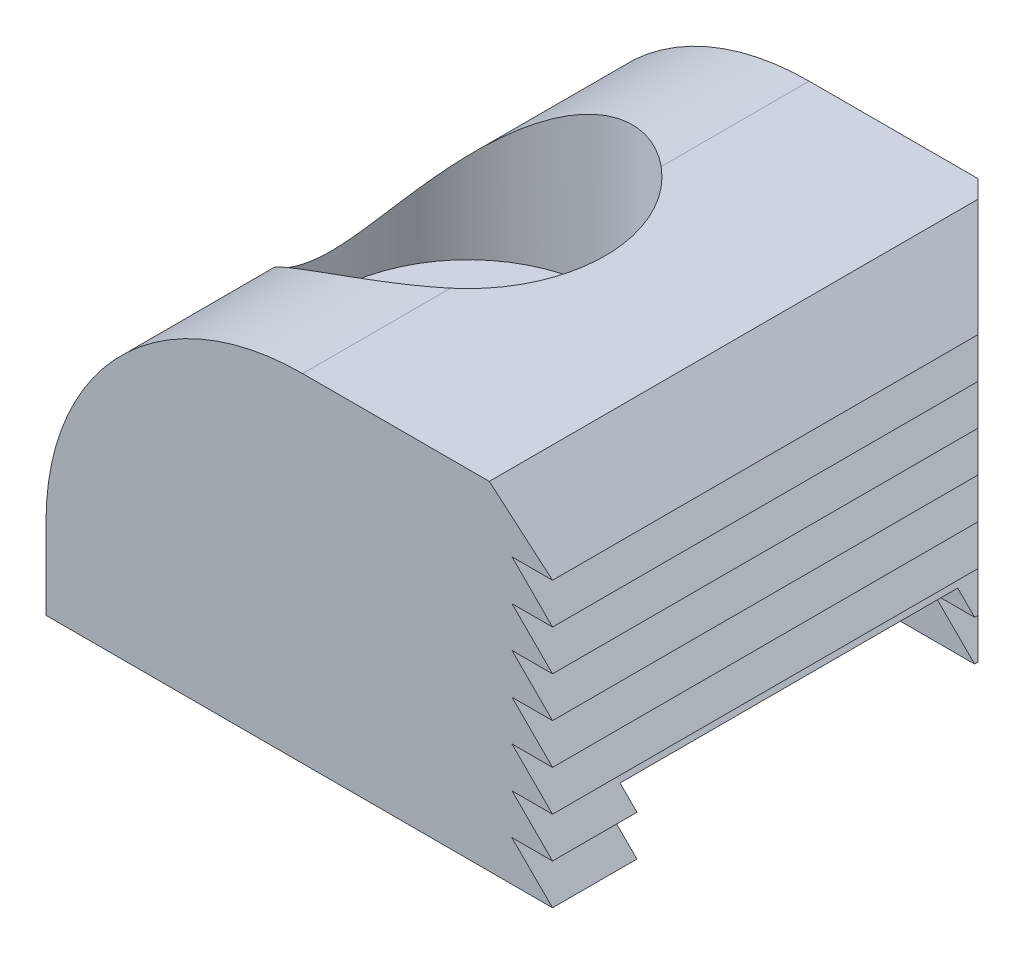
ISO-10303-21;
HEADER;
FILE_DESCRIPTION(('STEP AP214'),'2;1');
FILE_NAME('part.step','',(''),(''),'','','');
FILE_SCHEMA(('AUTOMOTIVE_DESIGN { 1 0 10303 214 1 1 1 1 }'));
ENDSEC;
DATA;
#1=APPLICATION_CONTEXT('core data for automotive mechanical design processes');
#2=APPLICATION_PROTOCOL_DEFINITION('international standard','automotive_design',2000,#1);
#3=PRODUCT_CONTEXT('',#1,'mechanical');
#4=PRODUCT('Part','Part','',(#3));
#5=PRODUCT_RELATED_PRODUCT_CATEGORY('part','',(#4));
#6=PRODUCT_DEFINITION_FORMATION('','',#4);
#7=PRODUCT_DEFINITION_CONTEXT('part definition',#1,'design');
#8=PRODUCT_DEFINITION('design','',#6,#7);
#9=PRODUCT_DEFINITION_SHAPE('','',#8);
#10=(LENGTH_UNIT() NAMED_UNIT(*) SI_UNIT(.MILLI.,.METRE.));
#11=(NAMED_UNIT(*) PLANE_ANGLE_UNIT() SI_UNIT($,.RADIAN.));
#12=(NAMED_UNIT(*) SI_UNIT($,.STERADIAN.) SOLID_ANGLE_UNIT());
#13=UNCERTAINTY_MEASURE_WITH_UNIT(LENGTH_MEASURE(1.E-05),#10,'distance_accuracy_value','');
#14=(GEOMETRIC_REPRESENTATION_CONTEXT(3) GLOBAL_UNCERTAINTY_ASSIGNED_CONTEXT((#13)) GLOBAL_UNIT_ASSIGNED_CONTEXT((#10,
#11,#12)) REPRESENTATION_CONTEXT('',''));
#15=CARTESIAN_POINT('',(0.,0.,0.));
#16=DIRECTION('',(0.,0.,1.));
#17=DIRECTION('',(1.,0.,0.));
#18=AXIS2_PLACEMENT_3D('',#15,#16,#17);
#19=CARTESIAN_POINT('',(9.652,-3.33693763246538,0.));
#20=DIRECTION('',(0.,0.,1.));
#21=DIRECTION('',(1.,0.,0.));
#22=AXIS2_PLACEMENT_3D('',#19,#20,#21);
#23=CYLINDRICAL_SURFACE('',#22,9.652);
#24=DIRECTION('',(0.,0.,-1.));
#25=VECTOR('',#24,1.);
#26=CARTESIAN_POINT('',(0.,-3.33693763246538,0.));
#27=LINE('',#26,#25);
#28=CARTESIAN_POINT('',(0.,-3.33693763246538,9.525));
#29=VERTEX_POINT('',#28);
#30=CARTESIAN_POINT('',(0.,-3.33693763246538,-9.525));
#31=VERTEX_POINT('',#30);
#32=EDGE_CURVE('E294',#29,#31,#27,.T.);
#33=ORIENTED_EDGE('',*,*,#32,.F.);
#34=CARTESIAN_POINT('',(9.652,-3.33693763246538,9.525));
#35=DIRECTION('',(0.,0.,-1.));
#36=DIRECTION('',(-1.,0.,0.));
#37=AXIS2_PLACEMENT_3D('',#34,#35,#36);
#38=CIRCLE('',#37,9.652);
#39=CARTESIAN_POINT('',(9.652,6.31506236753462,9.525));
#40=VERTEX_POINT('',#39);
#41=EDGE_CURVE('E318',#40,#29,#38,.F.);
#42=ORIENTED_EDGE('',*,*,#41,.F.);
#43=DIRECTION('',(0.,0.,-1.));
#44=VECTOR('',#43,1.);
#45=CARTESIAN_POINT('',(9.652,6.31506236753462,0.));
#46=LINE('',#45,#44);
#47=CARTESIAN_POINT('',(9.652,6.31506236753462,3.96020131306478));
#48=VERTEX_POINT('',#47);
#49=EDGE_CURVE('E259',#48,#40,#46,.F.);
#50=ORIENTED_EDGE('',*,*,#49,.F.);
#51=CARTESIAN_POINT('',(9.652,6.31506236753462,-3.96020131306478));
#52=CARTESIAN_POINT('',(9.5498199050069,6.31507265630244,-4.04542293708733));
#53=CARTESIAN_POINT('',(9.44430716040626,6.31344032708261,-4.12667015255437));
#54=CARTESIAN_POINT('',(9.22738867310542,6.30632604065309,-4.28073388266501));
#55=CARTESIAN_POINT('',(9.11598170572454,6.30084328048693,-4.3535486351398));
#56=CARTESIAN_POINT('',(8.88820903687942,6.28547127418843,-4.49015841113375));
#57=CARTESIAN_POINT('',(8.77184862060388,6.27558662320658,-4.55396274941192));
#58=CARTESIAN_POINT('',(8.5349841575829,6.25094797968316,-4.67223286497519));
#59=CARTESIAN_POINT('',(8.41448055410677,6.23619450660157,-4.72669963755387));
#60=CARTESIAN_POINT('',(8.17007884348161,6.20142045959126,-4.82609011750387));
#61=CARTESIAN_POINT('',(8.04617501644172,6.18139045230201,-4.87099647017519));
#62=CARTESIAN_POINT('',(7.79617530813473,6.1358216009373,-4.95098032679101));
#63=CARTESIAN_POINT('',(7.67007863676134,6.11028073177351,-4.98605420665242));
#64=CARTESIAN_POINT('',(7.41692635389342,6.05360844368939,-5.04628355442121));
#65=CARTESIAN_POINT('',(7.28987188007876,6.02248288502663,-5.07144933174537));
#66=CARTESIAN_POINT('',(7.03565690436223,5.9546268203021,-5.11202993300492));
#67=CARTESIAN_POINT('',(6.90849638054905,5.91789420731241,-5.12744108025322));
#68=CARTESIAN_POINT('',(6.65662734927728,5.83944638506792,-5.14860666135073));
#69=CARTESIAN_POINT('',(6.53190786099641,5.7977974957276,-5.1544767158451));
#70=CARTESIAN_POINT('',(6.28417205276451,5.70939731183465,-5.15726994649628));
#71=CARTESIAN_POINT('',(6.16115635427996,5.66264420799496,-5.15418994015681));
#72=CARTESIAN_POINT('',(5.79576872527315,5.51514553557289,-5.13212250251429));
#73=CARTESIAN_POINT('',(5.55697877425631,5.40713643875073,-5.10031361975937));
#74=CARTESIAN_POINT('',(5.07172973626527,5.16382462154896,-5.00195750607391));
#75=CARTESIAN_POINT('',(4.82672662066485,5.02689858862933,-4.9323749140016));
#76=CARTESIAN_POINT('',(4.35727908457225,4.73790405925048,-4.7621275451857));
#77=CARTESIAN_POINT('',(4.13284737474377,4.58582632034211,-4.66144371725706));
#78=CARTESIAN_POINT('',(3.76350550215528,4.31319100976371,-4.46405611674769));
#79=CARTESIAN_POINT('',(3.61339343195176,4.19509694488831,-4.37350528343616));
#80=CARTESIAN_POINT('',(3.32531788668719,3.95479424232148,-4.1794559870006));
#81=CARTESIAN_POINT('',(3.18735453639237,3.83258556239114,-4.07595739093068));
#82=CARTESIAN_POINT('',(2.92338799778348,3.58546500516873,-3.85671429155394));
#83=CARTESIAN_POINT('',(2.79741352424899,3.4605474761992,-3.74094172513649));
#84=CARTESIAN_POINT('',(2.55785441513575,3.21013757121912,-3.49787756546927));
#85=CARTESIAN_POINT('',(2.44426590354373,3.08464538792209,-3.37058959874874));
#86=CARTESIAN_POINT('',(2.25223274965274,2.86156329616766,-3.13255308790216));
#87=CARTESIAN_POINT('',(2.17142934318816,2.76367210113431,-3.02398031231244));
#88=CARTESIAN_POINT('',(2.01773064827471,2.57020127866494,-2.79935173323291));
#89=CARTESIAN_POINT('',(1.94483686435673,2.47462209368592,-2.68329451275768));
#90=CARTESIAN_POINT('',(1.80748105025036,2.2878307440007,-2.44355434168091));
#91=CARTESIAN_POINT('',(1.7429959109904,2.19660706676655,-2.31989372692717));
#92=CARTESIAN_POINT('',(1.62281870203423,2.02073718898965,-2.06400601648764));
#93=CARTESIAN_POINT('',(1.5671200725287,1.93608610570469,-1.93178541650986));
#94=CARTESIAN_POINT('',(1.46225271797532,1.77179939115867,-1.64936610974198));
#95=CARTESIAN_POINT('',(1.41369866036225,1.69279516354846,-1.49856153611027));
#96=CARTESIAN_POINT('',(1.3293771578117,1.55200923336524,-1.18569904927869));
#97=CARTESIAN_POINT('',(1.29358996285923,1.49020096197845,-1.02365898504788));
#98=CARTESIAN_POINT('',(1.24187026017632,1.39942514015905,-0.71659895222839));
#99=CARTESIAN_POINT('',(1.22365602826336,1.36675256515076,-0.573093576234786));
#100=CARTESIAN_POINT('',(1.19944477752231,1.32311385105439,-0.281854914211788));
#101=CARTESIAN_POINT('',(1.19343041719313,1.3121169017899,-0.134127932529159));
#102=CARTESIAN_POINT('',(1.19420575666567,1.31352668596921,0.161443628002224));
#103=CARTESIAN_POINT('',(1.20101851398767,1.32597556471977,0.309287940189907));
#104=CARTESIAN_POINT('',(1.22679186371245,1.37237621189909,0.600500142520499));
#105=CARTESIAN_POINT('',(1.24576983739812,1.4063587461475,0.743861319434351));
#106=CARTESIAN_POINT('',(1.30449740262346,1.50919876904701,1.08152183504694));
#107=CARTESIAN_POINT('',(1.34960418115294,1.5866839484327,1.27219581367968));
#108=CARTESIAN_POINT('',(1.45712526424442,1.76363552234426,1.63792326103005));
#109=CARTESIAN_POINT('',(1.51959797352423,1.86317585894052,1.8129213356505));
#110=CARTESIAN_POINT('',(1.65053071733687,2.06213943840468,2.12759506820695));
#111=CARTESIAN_POINT('',(1.71729456276134,2.16005446592775,2.26896248441957));
#112=CARTESIAN_POINT('',(1.86115271639638,2.36211455423867,2.54174117960632));
#113=CARTESIAN_POINT('',(1.93825453333294,2.46626411259604,2.67314511222003));
#114=CARTESIAN_POINT('',(2.10232463334536,2.67816847672798,2.92685708416846));
#115=CARTESIAN_POINT('',(2.18930542744099,2.78592772943494,3.04915325740314));
#116=CARTESIAN_POINT('',(2.37277395101704,3.00294920524562,3.28486929722818));
#117=CARTESIAN_POINT('',(2.46925930042156,3.11221104621316,3.39829137331868));
#118=CARTESIAN_POINT('',(2.67861575589638,3.3382669238152,3.62389540719421));
#119=CARTESIAN_POINT('',(2.79215751074991,3.45506195171626,3.73545507971485));
#120=CARTESIAN_POINT('',(3.02997029722527,3.68712366200068,3.94832445060814));
#121=CARTESIAN_POINT('',(3.15424288210933,3.80239012033231,4.04963266048098));
#122=CARTESIAN_POINT('',(3.41323535929083,4.02978264899015,4.24119183046905));
#123=CARTESIAN_POINT('',(3.54793700638176,4.14191375660394,4.33146141891937));
#124=CARTESIAN_POINT('',(3.82787163626985,4.36191393185475,4.50021906391816));
#125=CARTESIAN_POINT('',(3.97310548008676,4.46978264992015,4.57870615561945));
#126=CARTESIAN_POINT('',(4.24618296825254,4.66060458272654,4.70944505745998));
#127=CARTESIAN_POINT('',(4.37233146267602,4.74449928392301,4.76386849718004));
#128=CARTESIAN_POINT('',(4.63111098519171,4.90776798756518,4.86323158678523));
#129=CARTESIAN_POINT('',(4.76374065596987,4.98714292908173,4.90817321199577));
#130=CARTESIAN_POINT('',(5.03508020270358,5.14064795871205,4.98772257145255));
#131=CARTESIAN_POINT('',(5.17379199592603,5.21477637343177,5.02232701986135));
#132=CARTESIAN_POINT('',(5.45652012001272,5.35697257474782,5.08024620834094));
#133=CARTESIAN_POINT('',(5.60053406074814,5.42504304600904,5.10356596992063));
#134=CARTESIAN_POINT('',(5.8944187764567,5.55506709368841,5.1381847119216));
#135=CARTESIAN_POINT('',(6.04433267234228,5.61695527081453,5.14936546589495));
#136=CARTESIAN_POINT('',(6.34747013374335,5.73320746777246,5.15842810255943));
#137=CARTESIAN_POINT('',(6.50069375053475,5.78757137093756,5.15630977906695));
#138=CARTESIAN_POINT('',(6.8087414396419,5.88820210169364,5.13806647973519));
#139=CARTESIAN_POINT('',(6.96356306542272,5.93447978757886,5.12196046312798));
#140=CARTESIAN_POINT('',(7.27327809432175,6.01873052984422,5.07527999764991));
#141=CARTESIAN_POINT('',(7.42817147952068,6.05670507846205,5.04470815170425));
#142=CARTESIAN_POINT('',(7.71350752768924,6.11935415357739,4.97449028265757));
#143=CARTESIAN_POINT('',(7.8441966264966,6.14516326508192,4.93683941504562));
#144=CARTESIAN_POINT('',(8.10316164332057,6.19088972588237,4.85092120864088));
#145=CARTESIAN_POINT('',(8.23143654259081,6.21080463792107,4.80264949246027));
#146=CARTESIAN_POINT('',(8.48447127432828,6.24504029574331,4.69567026359144));
#147=CARTESIAN_POINT('',(8.60922761412099,6.25935565278526,4.63695277704712));
#148=CARTESIAN_POINT('',(8.8539502921863,6.28279858949162,4.50950719374196));
#149=CARTESIAN_POINT('',(8.9739187777131,6.29192851958392,4.44078365025932));
#150=CARTESIAN_POINT('',(9.20221149347913,6.3052200685889,4.29750218512099));
#151=CARTESIAN_POINT('',(9.31081782965703,6.30960912454235,4.2234135965756));
#152=CARTESIAN_POINT('',(9.52211073651756,6.31476702629258,4.06710996725251));
#153=CARTESIAN_POINT('',(9.62479706803935,6.31553572593254,3.9848945985267));
#154=CARTESIAN_POINT('',(9.82343425669457,6.31405018434085,3.81298766512504));
#155=CARTESIAN_POINT('',(9.91939396416691,6.31179999676562,3.72330627712291));
#156=CARTESIAN_POINT('',(10.1041419652241,6.30491011200844,3.53695647557787));
#157=CARTESIAN_POINT('',(10.1929316848539,6.30027089134411,3.44028945869591));
#158=CARTESIAN_POINT('',(10.2778622343753,6.29474967888265,3.34040367437355));
#159=B_SPLINE_CURVE_WITH_KNOTS('',3,(#51,#52,#53,#54,#55,#56,#57,#58,#59,#60,#61,#62,#63,#64,
#65,#66,#67,#68,#69,#70,#71,#72,#73,#74,#75,#76,#77,#78,#79,#80,#81,#82,#83,#84,#85,#86,#87,#88,
#89,#90,#91,#92,#93,#94,#95,#96,#97,#98,#99,#100,#101,#102,#103,#104,#105,#106,#107,#108,#109,
#110,#111,#112,#113,#114,#115,#116,#117,#118,#119,#120,#121,#122,#123,#124,#125,#126,#127,#128,
#129,#130,#131,#132,#133,#134,#135,#136,#137,#138,#139,#140,#141,#142,#143,#144,#145,#146,#147,
#148,#149,#150,#151,#152,#153,#154,#155,#156,#157,#158),.UNSPECIFIED.,.F.,.F.,(4,2,2,2,2,2,2,2,
2,2,2,2,2,2,2,2,2,2,2,2,2,2,2,2,2,2,2,2,2,2,2,2,2,2,2,2,2,2,2,2,2,2,2,2,2,2,2,2,2,2,2,2,2,4),
(0.,0.399074540379414,0.79823232719977,1.19697440490957,1.59567395413466,1.99509119162551,
2.39465545456784,2.79380286369613,3.19310062886868,3.58752254961611,3.9820847375532,
4.77096761699665,5.63540779147786,6.50037853578314,7.13374350459783,7.76711497725322,
8.40196716084153,9.03662010270682,9.53738519179449,10.0382453676792,10.537698662147,
11.0367772931288,11.5666391616303,12.0956777559208,12.5387255014225,12.9811430343731,
13.4243565989635,13.8682048290597,14.4967336869415,15.1274025214601,15.6800688290932,
16.2331387487542,16.7869170707711,17.3405570696408,17.932290409779,18.5241095459582,
19.1149157501229,19.7057703079711,20.1882705246237,20.6706701236029,21.1532228982645,
21.6355607465916,22.1225552559009,22.6095573153986,23.0959003097992,23.5821558267868,
23.9969149735175,24.4118453847164,24.8271741282542,25.242314462822,25.6365085812616,
26.0307186135114,26.4243998437207,26.8180025804912),.UNSPECIFIED.);
#160=CARTESIAN_POINT('',(9.652,6.31506236753462,-3.96020131306478));
#161=VERTEX_POINT('',#160);
#162=EDGE_CURVE('E310',#161,#48,#159,.T.);
#163=ORIENTED_EDGE('',*,*,#162,.F.);
#164=DIRECTION('',(0.,0.,-1.));
#165=VECTOR('',#164,1.);
#166=CARTESIAN_POINT('',(9.652,6.31506236753462,0.));
#167=LINE('',#166,#165);
#168=CARTESIAN_POINT('',(9.652,6.31506236753462,-9.525));
#169=VERTEX_POINT('',#168);
#170=EDGE_CURVE('E306',#169,#161,#167,.F.);
#171=ORIENTED_EDGE('',*,*,#170,.F.);
#172=CARTESIAN_POINT('',(9.652,-3.33693763246538,-9.525));
#173=DIRECTION('',(0.,0.,-1.));
#174=DIRECTION('',(-1.,0.,0.));
#175=AXIS2_PLACEMENT_3D('',#172,#173,#174);
#176=CIRCLE('',#175,9.652);
#177=EDGE_CURVE('E374',#31,#169,#176,.T.);
#178=ORIENTED_EDGE('',*,*,#177,.F.);
#179=EDGE_LOOP('',(#33,#42,#50,#163,#171,#178));
#180=FACE_BOUND('',#179,.T.);
#181=ADVANCED_FACE('F52',(#180),#23,.T.);
#182=CARTESIAN_POINT('',(19.05,-6.38493763246538,9.525));
#183=DIRECTION('',(0.,1.,0.));
#184=DIRECTION('',(0.,0.,1.));
#185=AXIS2_PLACEMENT_3D('',#182,#183,#184);
#186=PLANE('',#185);
#187=DIRECTION('',(-1.,0.,0.));
#188=VECTOR('',#187,1.);
#189=CARTESIAN_POINT('',(19.05,-6.38493763246538,-9.525));
#190=LINE('',#189,#188);
#191=CARTESIAN_POINT('',(16.002,-6.38493763246538,-9.525));
#192=VERTEX_POINT('',#191);
#193=CARTESIAN_POINT('',(0.,-6.38493763246538,-9.525));
#194=VERTEX_POINT('',#193);
#195=EDGE_CURVE('E268',#192,#194,#190,.T.);
#196=ORIENTED_EDGE('',*,*,#195,.F.);
#197=DIRECTION('',(-0.707106781186546,0.,-0.707106781186549));
#198=VECTOR('',#197,1.);
#199=CARTESIAN_POINT('',(16.002,-6.38493763246538,-9.525));
#200=LINE('',#199,#198);
#201=CARTESIAN_POINT('',(19.05,-6.38493763246538,-6.47699999999999));
#202=VERTEX_POINT('',#201);
#203=EDGE_CURVE('E287',#192,#202,#200,.F.);
#204=ORIENTED_EDGE('',*,*,#203,.T.);
#205=DIRECTION('',(0.,0.,-1.));
#206=VECTOR('',#205,1.);
#207=CARTESIAN_POINT('',(19.05,-6.38493763246538,9.525));
#208=LINE('',#207,#206);
#209=CARTESIAN_POINT('',(19.05,-6.38493763246538,-6.35));
#210=VERTEX_POINT('',#209);
#211=EDGE_CURVE('E270',#210,#202,#208,.T.);
#212=ORIENTED_EDGE('',*,*,#211,.F.);
#213=DIRECTION('',(-1.,0.,0.));
#214=VECTOR('',#213,1.);
#215=CARTESIAN_POINT('',(19.05,-6.38493763246538,-6.35));
#216=LINE('',#215,#214);
#217=CARTESIAN_POINT('',(0.,-6.38493763246538,-6.35));
#218=VERTEX_POINT('',#217);
#219=EDGE_CURVE('E443',#210,#218,#216,.T.);
#220=ORIENTED_EDGE('',*,*,#219,.T.);
#221=DIRECTION('',(0.,0.,-1.));
#222=VECTOR('',#221,1.);
#223=CARTESIAN_POINT('',(0.,-6.38493763246538,9.525));
#224=LINE('',#223,#222);
#225=EDGE_CURVE('E383',#218,#194,#224,.T.);
#226=ORIENTED_EDGE('',*,*,#225,.T.);
#227=EDGE_LOOP('',(#196,#204,#212,#220,#226));
#228=FACE_BOUND('',#227,.T.);
#229=ADVANCED_FACE('F355',(#228),#186,.F.);
#230=CARTESIAN_POINT('',(19.05,6.31506236753462,9.525));
#231=DIRECTION('',(0.,0.,-1.));
#232=DIRECTION('',(-1.,0.,0.));
#233=AXIS2_PLACEMENT_3D('',#230,#231,#232);
#234=PLANE('',#233);
#235=DIRECTION('',(-1.,0.,0.));
#236=VECTOR('',#235,1.);
#237=CARTESIAN_POINT('',(19.05,4.28306236753462,9.525));
#238=LINE('',#237,#236);
#239=CARTESIAN_POINT('',(19.05,4.28306236753462,9.525));
#240=VERTEX_POINT('',#239);
#241=CARTESIAN_POINT('',(17.526,4.28306236753462,9.525));
#242=VERTEX_POINT('',#241);
#243=EDGE_CURVE('E252',#240,#242,#238,.T.);
#244=ORIENTED_EDGE('',*,*,#243,.F.);
#245=DIRECTION('',(0.760172709036133,-0.64972105740592,0.));
#246=VECTOR('',#245,1.);
#247=CARTESIAN_POINT('',(19.05,4.28306236753462,9.525));
#248=LINE('',#247,#246);
#249=CARTESIAN_POINT('',(16.6725629027191,6.31506236753462,9.525));
#250=VERTEX_POINT('',#249);
#251=EDGE_CURVE('E236',#250,#240,#248,.T.);
#252=ORIENTED_EDGE('',*,*,#251,.F.);
#253=DIRECTION('',(-1.,0.,0.));
#254=VECTOR('',#253,1.);
#255=CARTESIAN_POINT('',(19.05,6.31506236753462,9.525));
#256=LINE('',#255,#254);
#257=EDGE_CURVE('E248',#250,#40,#256,.T.);
#258=ORIENTED_EDGE('',*,*,#257,.T.);
#259=ORIENTED_EDGE('',*,*,#41,.T.);
#260=DIRECTION('',(0.,-1.,0.));
#261=VECTOR('',#260,1.);
#262=CARTESIAN_POINT('',(0.,6.31506236753462,9.525));
#263=LINE('',#262,#261);
#264=CARTESIAN_POINT('',(0.,-6.38493763246538,9.525));
#265=VERTEX_POINT('',#264);
#266=EDGE_CURVE('E377',#29,#265,#263,.T.);
#267=ORIENTED_EDGE('',*,*,#266,.T.);
#268=DIRECTION('',(-1.,0.,0.));
#269=VECTOR('',#268,1.);
#270=CARTESIAN_POINT('',(19.05,-6.38493763246538,9.525));
#271=LINE('',#270,#269);
#272=CARTESIAN_POINT('',(19.05,-6.38493763246538,9.525));
#273=VERTEX_POINT('',#272);
#274=EDGE_CURVE('E279',#273,#265,#271,.T.);
#275=ORIENTED_EDGE('',*,*,#274,.F.);
#276=DIRECTION('',(0.709126234483074,-0.705081543913791,0.));
#277=VECTOR('',#276,1.);
#278=CARTESIAN_POINT('',(17.517257594982,-4.86093763246538,9.525));
#279=LINE('',#278,#277);
#280=CARTESIAN_POINT('',(17.517257594982,-4.86093763246538,9.525));
#281=VERTEX_POINT('',#280);
#282=EDGE_CURVE('E469',#281,#273,#279,.T.);
#283=ORIENTED_EDGE('',*,*,#282,.F.);
#284=DIRECTION('',(-1.,0.,0.));
#285=VECTOR('',#284,1.);
#286=CARTESIAN_POINT('',(19.05,-4.86093763246538,9.525));
#287=LINE('',#286,#285);
#288=CARTESIAN_POINT('',(19.05,-4.86093763246538,9.525));
#289=VERTEX_POINT('',#288);
#290=EDGE_CURVE('E471',#289,#281,#287,.T.);
#291=ORIENTED_EDGE('',*,*,#290,.F.);
#292=DIRECTION('',(0.707106781186548,-0.707106781186548,0.));
#293=VECTOR('',#292,1.);
#294=CARTESIAN_POINT('',(17.526,-3.33693763246538,9.525));
#295=LINE('',#294,#293);
#296=CARTESIAN_POINT('',(17.526,-3.33693763246538,9.525));
#297=VERTEX_POINT('',#296);
#298=EDGE_CURVE('E539',#297,#289,#295,.T.);
#299=ORIENTED_EDGE('',*,*,#298,.F.);
#300=DIRECTION('',(-1.,0.,0.));
#301=VECTOR('',#300,1.);
#302=CARTESIAN_POINT('',(19.05,-3.33693763246538,9.525));
#303=LINE('',#302,#301);
#304=CARTESIAN_POINT('',(19.05,-3.33693763246538,9.525));
#305=VERTEX_POINT('',#304);
#306=EDGE_CURVE('E534',#305,#297,#303,.T.);
#307=ORIENTED_EDGE('',*,*,#306,.F.);
#308=DIRECTION('',(0.707106781186548,-0.707106781186547,0.));
#309=VECTOR('',#308,1.);
#310=CARTESIAN_POINT('',(17.526,-1.81293763246538,9.525));
#311=LINE('',#310,#309);
#312=CARTESIAN_POINT('',(17.526,-1.81293763246538,9.525));
#313=VERTEX_POINT('',#312);
#314=EDGE_CURVE('E556',#313,#305,#311,.T.);
#315=ORIENTED_EDGE('',*,*,#314,.F.);
#316=DIRECTION('',(-1.,0.,0.));
#317=VECTOR('',#316,1.);
#318=CARTESIAN_POINT('',(19.05,-1.81293763246538,9.525));
#319=LINE('',#318,#317);
#320=CARTESIAN_POINT('',(19.05,-1.81293763246538,9.525));
#321=VERTEX_POINT('',#320);
#322=EDGE_CURVE('E550',#321,#313,#319,.T.);
#323=ORIENTED_EDGE('',*,*,#322,.F.);
#324=DIRECTION('',(0.707106781186548,-0.707106781186547,0.));
#325=VECTOR('',#324,1.);
#326=CARTESIAN_POINT('',(17.526,-0.28893763246538,9.525));
#327=LINE('',#326,#325);
#328=CARTESIAN_POINT('',(17.526,-0.28893763246538,9.525));
#329=VERTEX_POINT('',#328);
#330=EDGE_CURVE('E573',#329,#321,#327,.T.);
#331=ORIENTED_EDGE('',*,*,#330,.F.);
#332=DIRECTION('',(-1.,0.,0.));
#333=VECTOR('',#332,1.);
#334=CARTESIAN_POINT('',(19.05,-0.28893763246538,9.525));
#335=LINE('',#334,#333);
#336=CARTESIAN_POINT('',(19.05,-0.28893763246538,9.525));
#337=VERTEX_POINT('',#336);
#338=EDGE_CURVE('E567',#337,#329,#335,.T.);
#339=ORIENTED_EDGE('',*,*,#338,.F.);
#340=DIRECTION('',(0.707106781186548,-0.707106781186547,0.));
#341=VECTOR('',#340,1.);
#342=CARTESIAN_POINT('',(17.526,1.23506236753462,9.525));
#343=LINE('',#342,#341);
#344=CARTESIAN_POINT('',(17.526,1.23506236753462,9.525));
#345=VERTEX_POINT('',#344);
#346=EDGE_CURVE('E590',#345,#337,#343,.T.);
#347=ORIENTED_EDGE('',*,*,#346,.F.);
#348=DIRECTION('',(-1.,0.,0.));
#349=VECTOR('',#348,1.);
#350=CARTESIAN_POINT('',(19.05,1.23506236753462,9.525));
#351=LINE('',#350,#349);
#352=CARTESIAN_POINT('',(19.05,1.23506236753462,9.525));
#353=VERTEX_POINT('',#352);
#354=EDGE_CURVE('E584',#353,#345,#351,.T.);
#355=ORIENTED_EDGE('',*,*,#354,.F.);
#356=DIRECTION('',(0.707106781186548,-0.707106781186547,0.));
#357=VECTOR('',#356,1.);
#358=CARTESIAN_POINT('',(17.526,2.75906236753462,9.525));
#359=LINE('',#358,#357);
#360=CARTESIAN_POINT('',(17.526,2.75906236753462,9.525));
#361=VERTEX_POINT('',#360);
#362=EDGE_CURVE('E607',#361,#353,#359,.T.);
#363=ORIENTED_EDGE('',*,*,#362,.F.);
#364=DIRECTION('',(-1.,0.,0.));
#365=VECTOR('',#364,1.);
#366=CARTESIAN_POINT('',(19.05,2.75906236753462,9.525));
#367=LINE('',#366,#365);
#368=CARTESIAN_POINT('',(19.05,2.75906236753462,9.525));
#369=VERTEX_POINT('',#368);
#370=EDGE_CURVE('E601',#369,#361,#367,.T.);
#371=ORIENTED_EDGE('',*,*,#370,.F.);
#372=DIRECTION('',(0.707106781186548,-0.707106781186548,0.));
#373=VECTOR('',#372,1.);
#374=CARTESIAN_POINT('',(17.526,4.28306236753462,9.525));
#375=LINE('',#374,#373);
#376=EDGE_CURVE('E621',#242,#369,#375,.T.);
#377=ORIENTED_EDGE('',*,*,#376,.F.);
#378=EDGE_LOOP('',(#244,#252,#258,#259,#267,#275,#283,#291,#299,#307,#315,#323,#331,#339,#347,
#355,#363,#371,#377));
#379=FACE_BOUND('',#378,.T.);
#380=ADVANCED_FACE('F247',(#379),#234,.F.);
#381=CARTESIAN_POINT('',(0.,-6.38493763246538,6.35));
#382=VERTEX_POINT('',#381);
#383=EDGE_CURVE('E380',#265,#382,#224,.T.);
#384=ORIENTED_EDGE('',*,*,#383,.T.);
#385=DIRECTION('',(-1.,0.,0.));
#386=VECTOR('',#385,1.);
#387=CARTESIAN_POINT('',(19.05,-6.38493763246538,6.35));
#388=LINE('',#387,#386);
#389=CARTESIAN_POINT('',(19.05,-6.38493763246538,6.35));
#390=VERTEX_POINT('',#389);
#391=EDGE_CURVE('E447',#390,#382,#388,.T.);
#392=ORIENTED_EDGE('',*,*,#391,.F.);
#393=EDGE_CURVE('E262',#273,#390,#208,.T.);
#394=ORIENTED_EDGE('',*,*,#393,.F.);
#395=ORIENTED_EDGE('',*,*,#274,.T.);
#396=EDGE_LOOP('',(#384,#392,#394,#395));
#397=FACE_BOUND('',#396,.T.);
#398=ADVANCED_FACE('F350',(#397),#186,.F.);
#399=CARTESIAN_POINT('',(19.05,6.31506236753462,-9.525));
#400=DIRECTION('',(0.,0.,-1.));
#401=DIRECTION('',(-1.,0.,0.));
#402=AXIS2_PLACEMENT_3D('',#399,#400,#401);
#403=PLANE('',#402);
#404=DIRECTION('',(0.,-1.,0.));
#405=VECTOR('',#404,1.);
#406=CARTESIAN_POINT('',(0.,6.31506236753462,-9.525));
#407=LINE('',#406,#405);
#408=EDGE_CURVE('E273',#31,#194,#407,.T.);
#409=ORIENTED_EDGE('',*,*,#408,.F.);
#410=ORIENTED_EDGE('',*,*,#177,.T.);
#411=DIRECTION('',(-1.,0.,0.));
#412=VECTOR('',#411,1.);
#413=CARTESIAN_POINT('',(19.05,6.31506236753462,-9.525));
#414=LINE('',#413,#412);
#415=CARTESIAN_POINT('',(16.002,6.31506236753462,-9.525));
#416=VERTEX_POINT('',#415);
#417=EDGE_CURVE('E261',#416,#169,#414,.T.);
#418=ORIENTED_EDGE('',*,*,#417,.F.);
#419=DIRECTION('',(0.,-1.,0.));
#420=VECTOR('',#419,1.);
#421=CARTESIAN_POINT('',(16.002,6.31506236753462,-9.525));
#422=LINE('',#421,#420);
#423=EDGE_CURVE('E283',#416,#192,#422,.T.);
#424=ORIENTED_EDGE('',*,*,#423,.T.);
#425=ORIENTED_EDGE('',*,*,#195,.T.);
#426=EDGE_LOOP('',(#409,#410,#418,#424,#425));
#427=FACE_BOUND('',#426,.T.);
#428=ADVANCED_FACE('F347',(#427),#403,.T.);
#429=CARTESIAN_POINT('',(19.05,6.31506236753462,9.525));
#430=DIRECTION('',(0.,1.,0.));
#431=DIRECTION('',(0.,0.,1.));
#432=AXIS2_PLACEMENT_3D('',#429,#430,#431);
#433=PLANE('',#432);
#434=DIRECTION('',(0.,0.,1.));
#435=VECTOR('',#434,1.);
#436=CARTESIAN_POINT('',(16.6725629027191,6.31506236753462,-9.525));
#437=LINE('',#436,#435);
#438=CARTESIAN_POINT('',(16.6725629027191,6.31506236753462,-8.85443709728092));
#439=VERTEX_POINT('',#438);
#440=EDGE_CURVE('E233',#439,#250,#437,.T.);
#441=ORIENTED_EDGE('',*,*,#440,.F.);
#442=DIRECTION('',(0.707106781186546,0.,0.707106781186549));
#443=VECTOR('',#442,1.);
#444=CARTESIAN_POINT('',(27.051,6.31506236753462,1.52400000000003));
#445=LINE('',#444,#443);
#446=EDGE_CURVE('E291',#439,#416,#445,.F.);
#447=ORIENTED_EDGE('',*,*,#446,.T.);
#448=ORIENTED_EDGE('',*,*,#417,.T.);
#449=ORIENTED_EDGE('',*,*,#170,.T.);
#450=CARTESIAN_POINT('',(6.35,6.31506236753462,0.));
#451=DIRECTION('',(0.,1.,0.));
#452=DIRECTION('',(0.,0.,1.));
#453=AXIS2_PLACEMENT_3D('',#450,#451,#452);
#454=CIRCLE('',#453,5.1562);
#455=EDGE_CURVE('E420',#48,#161,#454,.T.);
#456=ORIENTED_EDGE('',*,*,#455,.F.);
#457=ORIENTED_EDGE('',*,*,#49,.T.);
#458=ORIENTED_EDGE('',*,*,#257,.F.);
#459=EDGE_LOOP('',(#441,#447,#448,#449,#456,#457,#458));
#460=FACE_BOUND('',#459,.T.);
#461=ADVANCED_FACE('F256',(#460),#433,.T.);
#462=CARTESIAN_POINT('',(0.,0.,0.));
#463=DIRECTION('',(1.,0.,0.));
#464=DIRECTION('',(0.,0.,-1.));
#465=AXIS2_PLACEMENT_3D('',#462,#463,#464);
#466=PLANE('',#465);
#467=ORIENTED_EDGE('',*,*,#266,.F.);
#468=ORIENTED_EDGE('',*,*,#32,.T.);
#469=ORIENTED_EDGE('',*,*,#408,.T.);
#470=ORIENTED_EDGE('',*,*,#225,.F.);
#471=DIRECTION('',(0.,-1.,0.));
#472=VECTOR('',#471,1.);
#473=CARTESIAN_POINT('',(0.,-4.22593763246538,-6.35));
#474=LINE('',#473,#472);
#475=CARTESIAN_POINT('',(0.,-4.22593763246538,-6.35));
#476=VERTEX_POINT('',#475);
#477=EDGE_CURVE('E429',#476,#218,#474,.T.);
#478=ORIENTED_EDGE('',*,*,#477,.F.);
#479=DIRECTION('',(0.,0.,-1.));
#480=VECTOR('',#479,1.);
#481=CARTESIAN_POINT('',(0.,-4.22593763246538,-6.35));
#482=LINE('',#481,#480);
#483=CARTESIAN_POINT('',(0.,-4.22593763246538,6.35));
#484=VERTEX_POINT('',#483);
#485=EDGE_CURVE('E440',#484,#476,#482,.T.);
#486=ORIENTED_EDGE('',*,*,#485,.F.);
#487=DIRECTION('',(0.,1.,0.));
#488=VECTOR('',#487,1.);
#489=CARTESIAN_POINT('',(0.,-4.22593763246538,6.35));
#490=LINE('',#489,#488);
#491=EDGE_CURVE('E436',#382,#484,#490,.T.);
#492=ORIENTED_EDGE('',*,*,#491,.F.);
#493=ORIENTED_EDGE('',*,*,#383,.F.);
#494=EDGE_LOOP('',(#467,#468,#469,#470,#478,#486,#492,#493));
#495=FACE_BOUND('',#494,.T.);
#496=ADVANCED_FACE('F340',(#495),#466,.F.);
#497=CARTESIAN_POINT('',(19.05,-4.22593763246538,-6.35));
#498=DIRECTION('',(0.,0.,-1.));
#499=DIRECTION('',(-1.,0.,0.));
#500=AXIS2_PLACEMENT_3D('',#497,#498,#499);
#501=PLANE('',#500);
#502=DIRECTION('',(1.,0.,0.));
#503=VECTOR('',#502,1.);
#504=CARTESIAN_POINT('',(19.05,-4.86093763246538,-6.35));
#505=LINE('',#504,#503);
#506=CARTESIAN_POINT('',(17.517257594982,-4.86093763246538,-6.35));
#507=VERTEX_POINT('',#506);
#508=CARTESIAN_POINT('',(19.05,-4.86093763246538,-6.35));
#509=VERTEX_POINT('',#508);
#510=EDGE_CURVE('E491',#507,#509,#505,.T.);
#511=ORIENTED_EDGE('',*,*,#510,.T.);
#512=DIRECTION('',(-0.707106781186548,0.707106781186548,0.));
#513=VECTOR('',#512,1.);
#514=CARTESIAN_POINT('',(18.7325,-4.54343763246538,-6.35));
#515=LINE('',#514,#513);
#516=CARTESIAN_POINT('',(18.415,-4.22593763246538,-6.35));
#517=VERTEX_POINT('',#516);
#518=EDGE_CURVE('E456',#509,#517,#515,.T.);
#519=ORIENTED_EDGE('',*,*,#518,.T.);
#520=DIRECTION('',(-1.,0.,0.));
#521=VECTOR('',#520,1.);
#522=CARTESIAN_POINT('',(19.05,-4.22593763246538,-6.35));
#523=LINE('',#522,#521);
#524=EDGE_CURVE('E384',#517,#476,#523,.T.);
#525=ORIENTED_EDGE('',*,*,#524,.T.);
#526=ORIENTED_EDGE('',*,*,#477,.T.);
#527=ORIENTED_EDGE('',*,*,#219,.F.);
#528=DIRECTION('',(-0.709126234483075,0.705081543913792,0.));
#529=VECTOR('',#528,1.);
#530=CARTESIAN_POINT('',(17.9705176601038,-5.31161240794238,-6.35));
#531=LINE('',#530,#529);
#532=EDGE_CURVE('E300',#210,#507,#531,.T.);
#533=ORIENTED_EDGE('',*,*,#532,.T.);
#534=EDGE_LOOP('',(#511,#519,#525,#526,#527,#533));
#535=FACE_BOUND('',#534,.T.);
#536=ADVANCED_FACE('F333',(#535),#501,.F.);
#537=CARTESIAN_POINT('',(19.05,-4.22593763246538,-6.35));
#538=DIRECTION('',(0.,1.,0.));
#539=DIRECTION('',(0.,0.,1.));
#540=AXIS2_PLACEMENT_3D('',#537,#538,#539);
#541=PLANE('',#540);
#542=CARTESIAN_POINT('',(6.35,-4.22593763246538,0.));
#543=DIRECTION('',(0.,1.,0.));
#544=DIRECTION('',(0.,0.,1.));
#545=AXIS2_PLACEMENT_3D('',#542,#543,#544);
#546=CIRCLE('',#545,3.2639);
#547=CARTESIAN_POINT('',(6.35,-4.22593763246538,3.2639));
#548=VERTEX_POINT('',#547);
#549=EDGE_CURVE('E299',#548,#548,#546,.T.);
#550=ORIENTED_EDGE('',*,*,#549,.T.);
#551=EDGE_LOOP('',(#550));
#552=FACE_BOUND('',#551,.T.);
#553=ORIENTED_EDGE('',*,*,#524,.F.);
#554=DIRECTION('',(0.,0.,1.));
#555=VECTOR('',#554,1.);
#556=CARTESIAN_POINT('',(18.415,-4.22593763246538,-6.35));
#557=LINE('',#556,#555);
#558=CARTESIAN_POINT('',(18.415,-4.22593763246538,6.35));
#559=VERTEX_POINT('',#558);
#560=EDGE_CURVE('E460',#517,#559,#557,.T.);
#561=ORIENTED_EDGE('',*,*,#560,.T.);
#562=DIRECTION('',(-1.,0.,0.));
#563=VECTOR('',#562,1.);
#564=CARTESIAN_POINT('',(19.05,-4.22593763246538,6.35));
#565=LINE('',#564,#563);
#566=EDGE_CURVE('E390',#559,#484,#565,.T.);
#567=ORIENTED_EDGE('',*,*,#566,.T.);
#568=ORIENTED_EDGE('',*,*,#485,.T.);
#569=EDGE_LOOP('',(#553,#561,#567,#568));
#570=FACE_BOUND('',#569,.T.);
#571=ADVANCED_FACE('F329',(#552,#570),#541,.F.);
#572=CARTESIAN_POINT('',(19.05,-4.22593763246538,6.35));
#573=DIRECTION('',(0.,0.,1.));
#574=DIRECTION('',(1.,0.,0.));
#575=AXIS2_PLACEMENT_3D('',#572,#573,#574);
#576=PLANE('',#575);
#577=ORIENTED_EDGE('',*,*,#566,.F.);
#578=DIRECTION('',(0.707106781186548,-0.707106781186548,0.));
#579=VECTOR('',#578,1.);
#580=CARTESIAN_POINT('',(18.7325,-4.54343763246538,6.35));
#581=LINE('',#580,#579);
#582=CARTESIAN_POINT('',(19.05,-4.86093763246538,6.34999999999999));
#583=VERTEX_POINT('',#582);
#584=EDGE_CURVE('E518',#559,#583,#581,.T.);
#585=ORIENTED_EDGE('',*,*,#584,.T.);
#586=DIRECTION('',(-1.,0.,0.));
#587=VECTOR('',#586,1.);
#588=CARTESIAN_POINT('',(19.05,-4.86093763246538,6.35));
#589=LINE('',#588,#587);
#590=CARTESIAN_POINT('',(17.517257594982,-4.86093763246538,6.35));
#591=VERTEX_POINT('',#590);
#592=EDGE_CURVE('E488',#583,#591,#589,.T.);
#593=ORIENTED_EDGE('',*,*,#592,.T.);
#594=DIRECTION('',(0.709126234483075,-0.705081543913792,0.));
#595=VECTOR('',#594,1.);
#596=CARTESIAN_POINT('',(17.9705176601038,-5.31161240794238,6.35));
#597=LINE('',#596,#595);
#598=EDGE_CURVE('E464',#591,#390,#597,.T.);
#599=ORIENTED_EDGE('',*,*,#598,.T.);
#600=ORIENTED_EDGE('',*,*,#391,.T.);
#601=ORIENTED_EDGE('',*,*,#491,.T.);
#602=EDGE_LOOP('',(#577,#585,#593,#599,#600,#601));
#603=FACE_BOUND('',#602,.T.);
#604=ADVANCED_FACE('F332',(#603),#576,.F.);
#605=CARTESIAN_POINT('',(16.002,6.31506236753462,-9.525));
#606=DIRECTION('',(-0.707106781186549,0.,0.707106781186546));
#607=DIRECTION('',(0.,-1.,0.));
#608=AXIS2_PLACEMENT_3D('',#605,#606,#607);
#609=PLANE('',#608);
#610=DIRECTION('',(0.605170417156624,-0.517240304304444,0.605170417156625));
#611=VECTOR('',#610,1.);
#612=CARTESIAN_POINT('',(16.1814007443104,6.73485959667178,-9.3455992556896));
#613=LINE('',#612,#611);
#614=CARTESIAN_POINT('',(19.05,4.28306236753462,-6.47699999999999));
#615=VERTEX_POINT('',#614);
#616=EDGE_CURVE('E239',#615,#439,#613,.F.);
#617=ORIENTED_EDGE('',*,*,#616,.F.);
#618=DIRECTION('',(-0.707106781186546,0.,-0.707106781186549));
#619=VECTOR('',#618,1.);
#620=CARTESIAN_POINT('',(16.002,4.28306236753462,-9.525));
#621=LINE('',#620,#619);
#622=CARTESIAN_POINT('',(17.526,4.28306236753462,-8.001));
#623=VERTEX_POINT('',#622);
#624=EDGE_CURVE('E13',#623,#615,#621,.F.);
#625=ORIENTED_EDGE('',*,*,#624,.F.);
#626=DIRECTION('',(0.577350269189625,-0.577350269189625,0.577350269189627));
#627=VECTOR('',#626,1.);
#628=CARTESIAN_POINT('',(15.8326666666667,5.97639570086795,-9.69433333333333));
#629=LINE('',#628,#627);
#630=CARTESIAN_POINT('',(19.05,2.75906236753462,-6.47699999999999));
#631=VERTEX_POINT('',#630);
#632=EDGE_CURVE('E610',#631,#623,#629,.F.);
#633=ORIENTED_EDGE('',*,*,#632,.F.);
#634=DIRECTION('',(-0.707106781186546,0.,-0.707106781186549));
#635=VECTOR('',#634,1.);
#636=CARTESIAN_POINT('',(16.002,2.75906236753462,-9.525));
#637=LINE('',#636,#635);
#638=CARTESIAN_POINT('',(17.526,2.75906236753462,-8.001));
#639=VERTEX_POINT('',#638);
#640=EDGE_CURVE('E61',#639,#631,#637,.F.);
#641=ORIENTED_EDGE('',*,*,#640,.F.);
#642=DIRECTION('',(0.577350269189625,-0.577350269189625,0.577350269189627));
#643=VECTOR('',#642,1.);
#644=CARTESIAN_POINT('',(15.3246666666667,4.96039570086795,-10.2023333333333));
#645=LINE('',#644,#643);
#646=CARTESIAN_POINT('',(19.05,1.23506236753462,-6.47699999999999));
#647=VERTEX_POINT('',#646);
#648=EDGE_CURVE('E593',#647,#639,#645,.F.);
#649=ORIENTED_EDGE('',*,*,#648,.F.);
#650=DIRECTION('',(-0.707106781186546,0.,-0.707106781186549));
#651=VECTOR('',#650,1.);
#652=CARTESIAN_POINT('',(16.002,1.23506236753462,-9.525));
#653=LINE('',#652,#651);
#654=CARTESIAN_POINT('',(17.526,1.23506236753462,-8.001));
#655=VERTEX_POINT('',#654);
#656=EDGE_CURVE('E678',#655,#647,#653,.F.);
#657=ORIENTED_EDGE('',*,*,#656,.F.);
#658=DIRECTION('',(0.577350269189625,-0.577350269189625,0.577350269189627));
#659=VECTOR('',#658,1.);
#660=CARTESIAN_POINT('',(14.8166666666667,3.94439570086795,-10.7103333333333));
#661=LINE('',#660,#659);
#662=CARTESIAN_POINT('',(19.05,-0.28893763246538,-6.47699999999999));
#663=VERTEX_POINT('',#662);
#664=EDGE_CURVE('E576',#663,#655,#661,.F.);
#665=ORIENTED_EDGE('',*,*,#664,.F.);
#666=DIRECTION('',(-0.707106781186546,0.,-0.707106781186549));
#667=VECTOR('',#666,1.);
#668=CARTESIAN_POINT('',(16.002,-0.28893763246538,-9.525));
#669=LINE('',#668,#667);
#670=CARTESIAN_POINT('',(17.526,-0.28893763246538,-8.001));
#671=VERTEX_POINT('',#670);
#672=EDGE_CURVE('E681',#671,#663,#669,.F.);
#673=ORIENTED_EDGE('',*,*,#672,.F.);
#674=DIRECTION('',(0.577350269189625,-0.577350269189625,0.577350269189627));
#675=VECTOR('',#674,1.);
#676=CARTESIAN_POINT('',(14.3086666666667,2.92839570086795,-11.2183333333333));
#677=LINE('',#676,#675);
#678=CARTESIAN_POINT('',(19.05,-1.81293763246538,-6.47699999999999));
#679=VERTEX_POINT('',#678);
#680=EDGE_CURVE('E559',#679,#671,#677,.F.);
#681=ORIENTED_EDGE('',*,*,#680,.F.);
#682=DIRECTION('',(-0.707106781186546,0.,-0.707106781186549));
#683=VECTOR('',#682,1.);
#684=CARTESIAN_POINT('',(16.002,-1.81293763246538,-9.525));
#685=LINE('',#684,#683);
#686=CARTESIAN_POINT('',(17.526,-1.81293763246538,-8.001));
#687=VERTEX_POINT('',#686);
#688=EDGE_CURVE('E687',#687,#679,#685,.F.);
#689=ORIENTED_EDGE('',*,*,#688,.F.);
#690=DIRECTION('',(0.577350269189625,-0.577350269189625,0.577350269189627));
#691=VECTOR('',#690,1.);
#692=CARTESIAN_POINT('',(13.8006666666667,1.91239570086794,-11.7263333333333));
#693=LINE('',#692,#691);
#694=CARTESIAN_POINT('',(19.05,-3.33693763246538,-6.47699999999999));
#695=VERTEX_POINT('',#694);
#696=EDGE_CURVE('E542',#695,#687,#693,.F.);
#697=ORIENTED_EDGE('',*,*,#696,.F.);
#698=DIRECTION('',(-0.707106781186546,0.,-0.707106781186549));
#699=VECTOR('',#698,1.);
#700=CARTESIAN_POINT('',(16.002,-3.33693763246538,-9.525));
#701=LINE('',#700,#699);
#702=CARTESIAN_POINT('',(17.526,-3.33693763246538,-8.001));
#703=VERTEX_POINT('',#702);
#704=EDGE_CURVE('E414',#703,#695,#701,.F.);
#705=ORIENTED_EDGE('',*,*,#704,.F.);
#706=DIRECTION('',(0.577350269189625,-0.577350269189625,0.577350269189627));
#707=VECTOR('',#706,1.);
#708=CARTESIAN_POINT('',(13.2926666666667,0.896395700867946,-12.2343333333333));
#709=LINE('',#708,#707);
#710=CARTESIAN_POINT('',(19.05,-4.86093763246538,-6.47699999999999));
#711=VERTEX_POINT('',#710);
#712=EDGE_CURVE('E512',#711,#703,#709,.F.);
#713=ORIENTED_EDGE('',*,*,#712,.F.);
#714=DIRECTION('',(-0.707106781186546,0.,-0.707106781186549));
#715=VECTOR('',#714,1.);
#716=CARTESIAN_POINT('',(16.002,-4.86093763246538,-9.525));
#717=LINE('',#716,#715);
#718=CARTESIAN_POINT('',(17.517257594982,-4.86093763246538,-8.00974240501797));
#719=VERTEX_POINT('',#718);
#720=EDGE_CURVE('E412',#719,#711,#717,.F.);
#721=ORIENTED_EDGE('',*,*,#720,.F.);
#722=DIRECTION('',(0.578447951631639,-0.575148619494405,0.578447951631641));
#723=VECTOR('',#722,1.);
#724=CARTESIAN_POINT('',(12.7850580398304,-0.15572943933358,-12.7419419601696));
#725=LINE('',#724,#723);
#726=EDGE_CURVE('E405',#202,#719,#725,.F.);
#727=ORIENTED_EDGE('',*,*,#726,.F.);
#728=ORIENTED_EDGE('',*,*,#203,.F.);
#729=ORIENTED_EDGE('',*,*,#423,.F.);
#730=ORIENTED_EDGE('',*,*,#446,.F.);
#731=EDGE_LOOP('',(#617,#625,#633,#641,#649,#657,#665,#673,#681,#689,#697,#705,#713,#721,#727,
#728,#729,#730));
#732=FACE_BOUND('',#731,.T.);
#733=ADVANCED_FACE('F326',(#732),#609,.F.);
#734=CARTESIAN_POINT('',(6.35,-0.0349376324653818,0.));
#735=DIRECTION('',(0.,1.,0.));
#736=DIRECTION('',(0.,0.,1.));
#737=AXIS2_PLACEMENT_3D('',#734,#735,#736);
#738=CYLINDRICAL_SURFACE('',#737,5.1562);
#739=CARTESIAN_POINT('',(6.35,-0.0349376324653818,0.));
#740=DIRECTION('',(0.,1.,0.));
#741=DIRECTION('',(0.,0.,1.));
#742=AXIS2_PLACEMENT_3D('',#739,#740,#741);
#743=CIRCLE('',#742,5.1562);
#744=CARTESIAN_POINT('',(6.35,-0.0349376324653818,5.1562));
#745=VERTEX_POINT('',#744);
#746=EDGE_CURVE('E423',#745,#745,#743,.T.);
#747=ORIENTED_EDGE('',*,*,#746,.F.);
#748=EDGE_LOOP('',(#747));
#749=FACE_BOUND('',#748,.T.);
#750=ORIENTED_EDGE('',*,*,#455,.T.);
#751=ORIENTED_EDGE('',*,*,#162,.T.);
#752=EDGE_LOOP('',(#750,#751));
#753=FACE_BOUND('',#752,.T.);
#754=ADVANCED_FACE('F320',(#749,#753),#738,.F.);
#755=CARTESIAN_POINT('',(6.35,-0.0349376324653818,0.));
#756=DIRECTION('',(0.,1.,0.));
#757=DIRECTION('',(0.,0.,1.));
#758=AXIS2_PLACEMENT_3D('',#755,#756,#757);
#759=PLANE('',#758);
#760=CARTESIAN_POINT('',(6.35,-0.0349376324653818,0.));
#761=DIRECTION('',(0.,1.,0.));
#762=DIRECTION('',(0.,0.,1.));
#763=AXIS2_PLACEMENT_3D('',#760,#761,#762);
#764=CIRCLE('',#763,3.2639);
#765=CARTESIAN_POINT('',(6.35,-0.0349376324653818,3.2639));
#766=VERTEX_POINT('',#765);
#767=EDGE_CURVE('E295',#766,#766,#764,.T.);
#768=ORIENTED_EDGE('',*,*,#767,.F.);
#769=EDGE_LOOP('',(#768));
#770=FACE_BOUND('',#769,.T.);
#771=ORIENTED_EDGE('',*,*,#746,.T.);
#772=EDGE_LOOP('',(#771));
#773=FACE_BOUND('',#772,.T.);
#774=ADVANCED_FACE('F325',(#770,#773),#759,.T.);
#775=CARTESIAN_POINT('',(6.35,-6.38493763246538,0.));
#776=DIRECTION('',(0.,1.,0.));
#777=DIRECTION('',(0.,0.,1.));
#778=AXIS2_PLACEMENT_3D('',#775,#776,#777);
#779=CYLINDRICAL_SURFACE('',#778,3.2639);
#780=ORIENTED_EDGE('',*,*,#767,.T.);
#781=EDGE_LOOP('',(#780));
#782=FACE_BOUND('',#781,.T.);
#783=ORIENTED_EDGE('',*,*,#549,.F.);
#784=EDGE_LOOP('',(#783));
#785=FACE_BOUND('',#784,.T.);
#786=ADVANCED_FACE('F729',(#782,#785),#779,.F.);
#787=CARTESIAN_POINT('',(19.05,-4.86093763246538,-9.525));
#788=DIRECTION('',(0.,1.,0.));
#789=DIRECTION('',(0.,0.,1.));
#790=AXIS2_PLACEMENT_3D('',#787,#788,#789);
#791=PLANE('',#790);
#792=DIRECTION('',(0.,0.,1.));
#793=VECTOR('',#792,1.);
#794=CARTESIAN_POINT('',(17.517257594982,-4.86093763246538,-9.525));
#795=LINE('',#794,#793);
#796=EDGE_CURVE('E76',#719,#507,#795,.T.);
#797=ORIENTED_EDGE('',*,*,#796,.F.);
#798=ORIENTED_EDGE('',*,*,#720,.T.);
#799=DIRECTION('',(0.,0.,1.));
#800=VECTOR('',#799,1.);
#801=CARTESIAN_POINT('',(19.05,-4.86093763246538,-9.525));
#802=LINE('',#801,#800);
#803=EDGE_CURVE('E484',#711,#509,#802,.T.);
#804=ORIENTED_EDGE('',*,*,#803,.T.);
#805=ORIENTED_EDGE('',*,*,#510,.F.);
#806=EDGE_LOOP('',(#797,#798,#804,#805));
#807=FACE_BOUND('',#806,.T.);
#808=ADVANCED_FACE('F499',(#807),#791,.F.);
#809=CARTESIAN_POINT('',(17.517257594982,-4.86093763246538,-9.525));
#810=DIRECTION('',(-0.705081543913791,-0.709126234483074,0.));
#811=DIRECTION('',(0.709126234483074,-0.705081543913791,0.));
#812=AXIS2_PLACEMENT_3D('',#809,#810,#811);
#813=PLANE('',#812);
#814=ORIENTED_EDGE('',*,*,#211,.T.);
#815=ORIENTED_EDGE('',*,*,#726,.T.);
#816=ORIENTED_EDGE('',*,*,#796,.T.);
#817=ORIENTED_EDGE('',*,*,#532,.F.);
#818=EDGE_LOOP('',(#814,#815,#816,#817));
#819=FACE_BOUND('',#818,.T.);
#820=ADVANCED_FACE('F404',(#819),#813,.F.);
#821=EDGE_CURVE('E68',#591,#281,#795,.T.);
#822=ORIENTED_EDGE('',*,*,#821,.T.);
#823=ORIENTED_EDGE('',*,*,#282,.T.);
#824=ORIENTED_EDGE('',*,*,#393,.T.);
#825=ORIENTED_EDGE('',*,*,#598,.F.);
#826=EDGE_LOOP('',(#822,#823,#824,#825));
#827=FACE_BOUND('',#826,.T.);
#828=ADVANCED_FACE('F720',(#827),#813,.F.);
#829=EDGE_CURVE('E477',#583,#289,#802,.T.);
#830=ORIENTED_EDGE('',*,*,#829,.T.);
#831=ORIENTED_EDGE('',*,*,#290,.T.);
#832=ORIENTED_EDGE('',*,*,#821,.F.);
#833=ORIENTED_EDGE('',*,*,#592,.F.);
#834=EDGE_LOOP('',(#830,#831,#832,#833));
#835=FACE_BOUND('',#834,.T.);
#836=ADVANCED_FACE('F718',(#835),#791,.F.);
#837=CARTESIAN_POINT('',(17.526,-3.33693763246538,-9.525));
#838=DIRECTION('',(-0.707106781186548,-0.707106781186548,0.));
#839=DIRECTION('',(0.707106781186548,-0.707106781186548,0.));
#840=AXIS2_PLACEMENT_3D('',#837,#838,#839);
#841=PLANE('',#840);
#842=ORIENTED_EDGE('',*,*,#803,.F.);
#843=ORIENTED_EDGE('',*,*,#712,.T.);
#844=DIRECTION('',(0.,0.,1.));
#845=VECTOR('',#844,1.);
#846=CARTESIAN_POINT('',(17.526,-3.33693763246538,-9.525));
#847=LINE('',#846,#845);
#848=EDGE_CURVE('E519',#703,#297,#847,.T.);
#849=ORIENTED_EDGE('',*,*,#848,.T.);
#850=ORIENTED_EDGE('',*,*,#298,.T.);
#851=ORIENTED_EDGE('',*,*,#829,.F.);
#852=ORIENTED_EDGE('',*,*,#584,.F.);
#853=ORIENTED_EDGE('',*,*,#560,.F.);
#854=ORIENTED_EDGE('',*,*,#518,.F.);
#855=EDGE_LOOP('',(#842,#843,#849,#850,#851,#852,#853,#854));
#856=FACE_BOUND('',#855,.T.);
#857=ADVANCED_FACE('F511',(#856),#841,.F.);
#858=CARTESIAN_POINT('',(19.05,-3.33693763246538,-9.525));
#859=DIRECTION('',(0.,1.,0.));
#860=DIRECTION('',(0.,0.,1.));
#861=AXIS2_PLACEMENT_3D('',#858,#859,#860);
#862=PLANE('',#861);
#863=ORIENTED_EDGE('',*,*,#704,.T.);
#864=DIRECTION('',(0.,0.,1.));
#865=VECTOR('',#864,1.);
#866=CARTESIAN_POINT('',(19.05,-3.33693763246538,-9.525));
#867=LINE('',#866,#865);
#868=EDGE_CURVE('E525',#695,#305,#867,.T.);
#869=ORIENTED_EDGE('',*,*,#868,.T.);
#870=ORIENTED_EDGE('',*,*,#306,.T.);
#871=ORIENTED_EDGE('',*,*,#848,.F.);
#872=EDGE_LOOP('',(#863,#869,#870,#871));
#873=FACE_BOUND('',#872,.T.);
#874=ADVANCED_FACE('F716',(#873),#862,.F.);
#875=CARTESIAN_POINT('',(17.526,-1.81293763246538,-9.525));
#876=DIRECTION('',(-0.707106781186547,-0.707106781186548,0.));
#877=DIRECTION('',(0.707106781186548,-0.707106781186547,0.));
#878=AXIS2_PLACEMENT_3D('',#875,#876,#877);
#879=PLANE('',#878);
#880=ORIENTED_EDGE('',*,*,#696,.T.);
#881=DIRECTION('',(0.,0.,1.));
#882=VECTOR('',#881,1.);
#883=CARTESIAN_POINT('',(17.526,-1.81293763246538,-9.525));
#884=LINE('',#883,#882);
#885=EDGE_CURVE('E545',#687,#313,#884,.T.);
#886=ORIENTED_EDGE('',*,*,#885,.T.);
#887=ORIENTED_EDGE('',*,*,#314,.T.);
#888=ORIENTED_EDGE('',*,*,#868,.F.);
#889=EDGE_LOOP('',(#880,#886,#887,#888));
#890=FACE_BOUND('',#889,.T.);
#891=ADVANCED_FACE('F870',(#890),#879,.F.);
#892=CARTESIAN_POINT('',(19.05,-1.81293763246538,-9.525));
#893=DIRECTION('',(0.,1.,0.));
#894=DIRECTION('',(0.,0.,1.));
#895=AXIS2_PLACEMENT_3D('',#892,#893,#894);
#896=PLANE('',#895);
#897=ORIENTED_EDGE('',*,*,#688,.T.);
#898=DIRECTION('',(0.,0.,1.));
#899=VECTOR('',#898,1.);
#900=CARTESIAN_POINT('',(19.05,-1.81293763246538,-9.525));
#901=LINE('',#900,#899);
#902=EDGE_CURVE('E546',#679,#321,#901,.T.);
#903=ORIENTED_EDGE('',*,*,#902,.T.);
#904=ORIENTED_EDGE('',*,*,#322,.T.);
#905=ORIENTED_EDGE('',*,*,#885,.F.);
#906=EDGE_LOOP('',(#897,#903,#904,#905));
#907=FACE_BOUND('',#906,.T.);
#908=ADVANCED_FACE('F879',(#907),#896,.F.);
#909=CARTESIAN_POINT('',(17.526,-0.28893763246538,-9.525));
#910=DIRECTION('',(-0.707106781186547,-0.707106781186548,0.));
#911=DIRECTION('',(0.707106781186548,-0.707106781186547,0.));
#912=AXIS2_PLACEMENT_3D('',#909,#910,#911);
#913=PLANE('',#912);
#914=ORIENTED_EDGE('',*,*,#680,.T.);
#915=DIRECTION('',(0.,0.,1.));
#916=VECTOR('',#915,1.);
#917=CARTESIAN_POINT('',(17.526,-0.28893763246538,-9.525));
#918=LINE('',#917,#916);
#919=EDGE_CURVE('E562',#671,#329,#918,.T.);
#920=ORIENTED_EDGE('',*,*,#919,.T.);
#921=ORIENTED_EDGE('',*,*,#330,.T.);
#922=ORIENTED_EDGE('',*,*,#902,.F.);
#923=EDGE_LOOP('',(#914,#920,#921,#922));
#924=FACE_BOUND('',#923,.T.);
#925=ADVANCED_FACE('F889',(#924),#913,.F.);
#926=CARTESIAN_POINT('',(19.05,-0.28893763246538,-9.525));
#927=DIRECTION('',(0.,1.,0.));
#928=DIRECTION('',(0.,0.,1.));
#929=AXIS2_PLACEMENT_3D('',#926,#927,#928);
#930=PLANE('',#929);
#931=ORIENTED_EDGE('',*,*,#672,.T.);
#932=DIRECTION('',(0.,0.,1.));
#933=VECTOR('',#932,1.);
#934=CARTESIAN_POINT('',(19.05,-0.28893763246538,-9.525));
#935=LINE('',#934,#933);
#936=EDGE_CURVE('E563',#663,#337,#935,.T.);
#937=ORIENTED_EDGE('',*,*,#936,.T.);
#938=ORIENTED_EDGE('',*,*,#338,.T.);
#939=ORIENTED_EDGE('',*,*,#919,.F.);
#940=EDGE_LOOP('',(#931,#937,#938,#939));
#941=FACE_BOUND('',#940,.T.);
#942=ADVANCED_FACE('F899',(#941),#930,.F.);
#943=CARTESIAN_POINT('',(17.526,1.23506236753462,-9.525));
#944=DIRECTION('',(-0.707106781186547,-0.707106781186548,0.));
#945=DIRECTION('',(0.707106781186548,-0.707106781186547,0.));
#946=AXIS2_PLACEMENT_3D('',#943,#944,#945);
#947=PLANE('',#946);
#948=ORIENTED_EDGE('',*,*,#664,.T.);
#949=DIRECTION('',(0.,0.,1.));
#950=VECTOR('',#949,1.);
#951=CARTESIAN_POINT('',(17.526,1.23506236753462,-9.525));
#952=LINE('',#951,#950);
#953=EDGE_CURVE('E579',#655,#345,#952,.T.);
#954=ORIENTED_EDGE('',*,*,#953,.T.);
#955=ORIENTED_EDGE('',*,*,#346,.T.);
#956=ORIENTED_EDGE('',*,*,#936,.F.);
#957=EDGE_LOOP('',(#948,#954,#955,#956));
#958=FACE_BOUND('',#957,.T.);
#959=ADVANCED_FACE('F909',(#958),#947,.F.);
#960=CARTESIAN_POINT('',(19.05,1.23506236753462,-9.525));
#961=DIRECTION('',(0.,1.,0.));
#962=DIRECTION('',(0.,0.,1.));
#963=AXIS2_PLACEMENT_3D('',#960,#961,#962);
#964=PLANE('',#963);
#965=ORIENTED_EDGE('',*,*,#656,.T.);
#966=DIRECTION('',(0.,0.,1.));
#967=VECTOR('',#966,1.);
#968=CARTESIAN_POINT('',(19.05,1.23506236753462,-9.525));
#969=LINE('',#968,#967);
#970=EDGE_CURVE('E580',#647,#353,#969,.T.);
#971=ORIENTED_EDGE('',*,*,#970,.T.);
#972=ORIENTED_EDGE('',*,*,#354,.T.);
#973=ORIENTED_EDGE('',*,*,#953,.F.);
#974=EDGE_LOOP('',(#965,#971,#972,#973));
#975=FACE_BOUND('',#974,.T.);
#976=ADVANCED_FACE('F675',(#975),#964,.F.);
#977=CARTESIAN_POINT('',(17.526,2.75906236753462,-9.525));
#978=DIRECTION('',(-0.707106781186547,-0.707106781186548,0.));
#979=DIRECTION('',(0.707106781186548,-0.707106781186547,0.));
#980=AXIS2_PLACEMENT_3D('',#977,#978,#979);
#981=PLANE('',#980);
#982=ORIENTED_EDGE('',*,*,#648,.T.);
#983=DIRECTION('',(0.,0.,1.));
#984=VECTOR('',#983,1.);
#985=CARTESIAN_POINT('',(17.526,2.75906236753462,-9.525));
#986=LINE('',#985,#984);
#987=EDGE_CURVE('E596',#639,#361,#986,.T.);
#988=ORIENTED_EDGE('',*,*,#987,.T.);
#989=ORIENTED_EDGE('',*,*,#362,.T.);
#990=ORIENTED_EDGE('',*,*,#970,.F.);
#991=EDGE_LOOP('',(#982,#988,#989,#990));
#992=FACE_BOUND('',#991,.T.);
#993=ADVANCED_FACE('F671',(#992),#981,.F.);
#994=CARTESIAN_POINT('',(19.05,2.75906236753462,-9.525));
#995=DIRECTION('',(0.,1.,0.));
#996=DIRECTION('',(0.,0.,1.));
#997=AXIS2_PLACEMENT_3D('',#994,#995,#996);
#998=PLANE('',#997);
#999=ORIENTED_EDGE('',*,*,#640,.T.);
#1000=DIRECTION('',(0.,0.,1.));
#1001=VECTOR('',#1000,1.);
#1002=CARTESIAN_POINT('',(19.05,2.75906236753462,-9.525));
#1003=LINE('',#1002,#1001);
#1004=EDGE_CURVE('E597',#631,#369,#1003,.T.);
#1005=ORIENTED_EDGE('',*,*,#1004,.T.);
#1006=ORIENTED_EDGE('',*,*,#370,.T.);
#1007=ORIENTED_EDGE('',*,*,#987,.F.);
#1008=EDGE_LOOP('',(#999,#1005,#1006,#1007));
#1009=FACE_BOUND('',#1008,.T.);
#1010=ADVANCED_FACE('F664',(#1009),#998,.F.);
#1011=CARTESIAN_POINT('',(17.526,4.28306236753462,-9.525));
#1012=DIRECTION('',(-0.707106781186548,-0.707106781186548,0.));
#1013=DIRECTION('',(0.707106781186548,-0.707106781186548,0.));
#1014=AXIS2_PLACEMENT_3D('',#1011,#1012,#1013);
#1015=PLANE('',#1014);
#1016=ORIENTED_EDGE('',*,*,#632,.T.);
#1017=DIRECTION('',(0.,0.,1.));
#1018=VECTOR('',#1017,1.);
#1019=CARTESIAN_POINT('',(17.526,4.28306236753462,-9.525));
#1020=LINE('',#1019,#1018);
#1021=EDGE_CURVE('E613',#623,#242,#1020,.T.);
#1022=ORIENTED_EDGE('',*,*,#1021,.T.);
#1023=ORIENTED_EDGE('',*,*,#376,.T.);
#1024=ORIENTED_EDGE('',*,*,#1004,.F.);
#1025=EDGE_LOOP('',(#1016,#1022,#1023,#1024));
#1026=FACE_BOUND('',#1025,.T.);
#1027=ADVANCED_FACE('F658',(#1026),#1015,.F.);
#1028=CARTESIAN_POINT('',(19.05,4.28306236753462,-9.525));
#1029=DIRECTION('',(0.,1.,0.));
#1030=DIRECTION('',(0.,0.,1.));
#1031=AXIS2_PLACEMENT_3D('',#1028,#1029,#1030);
#1032=PLANE('',#1031);
#1033=ORIENTED_EDGE('',*,*,#624,.T.);
#1034=DIRECTION('',(0.,0.,1.));
#1035=VECTOR('',#1034,1.);
#1036=CARTESIAN_POINT('',(19.05,4.28306236753462,-9.525));
#1037=LINE('',#1036,#1035);
#1038=EDGE_CURVE('E614',#615,#240,#1037,.T.);
#1039=ORIENTED_EDGE('',*,*,#1038,.T.);
#1040=ORIENTED_EDGE('',*,*,#243,.T.);
#1041=ORIENTED_EDGE('',*,*,#1021,.F.);
#1042=EDGE_LOOP('',(#1033,#1039,#1040,#1041));
#1043=FACE_BOUND('',#1042,.T.);
#1044=ADVANCED_FACE('F952',(#1043),#1032,.F.);
#1045=CARTESIAN_POINT('',(19.05,4.28306236753462,-9.525));
#1046=DIRECTION('',(-0.64972105740592,-0.760172709036133,0.));
#1047=DIRECTION('',(0.760172709036133,-0.64972105740592,0.));
#1048=AXIS2_PLACEMENT_3D('',#1045,#1046,#1047);
#1049=PLANE('',#1048);
#1050=ORIENTED_EDGE('',*,*,#616,.T.);
#1051=ORIENTED_EDGE('',*,*,#440,.T.);
#1052=ORIENTED_EDGE('',*,*,#251,.T.);
#1053=ORIENTED_EDGE('',*,*,#1038,.F.);
#1054=EDGE_LOOP('',(#1050,#1051,#1052,#1053));
#1055=FACE_BOUND('',#1054,.T.);
#1056=ADVANCED_FACE('F235',(#1055),#1049,.F.);
#1057=CLOSED_SHELL('',(#181,#229,#380,#398,#428,#461,#496,#536,#571,#604,#733,#754,#774,#786,
#808,#820,#828,#836,#857,#874,#891,#908,#925,#942,#959,#976,#993,#1010,#1027,#1044,#1056));
#1058=MANIFOLD_SOLID_BREP('B2',#1057);
#1059=ADVANCED_BREP_SHAPE_REPRESENTATION('',(#18,#1058),#14);
#1060=SHAPE_DEFINITION_REPRESENTATION(#9,#1059);
ENDSEC;
END-ISO-10303-21;
